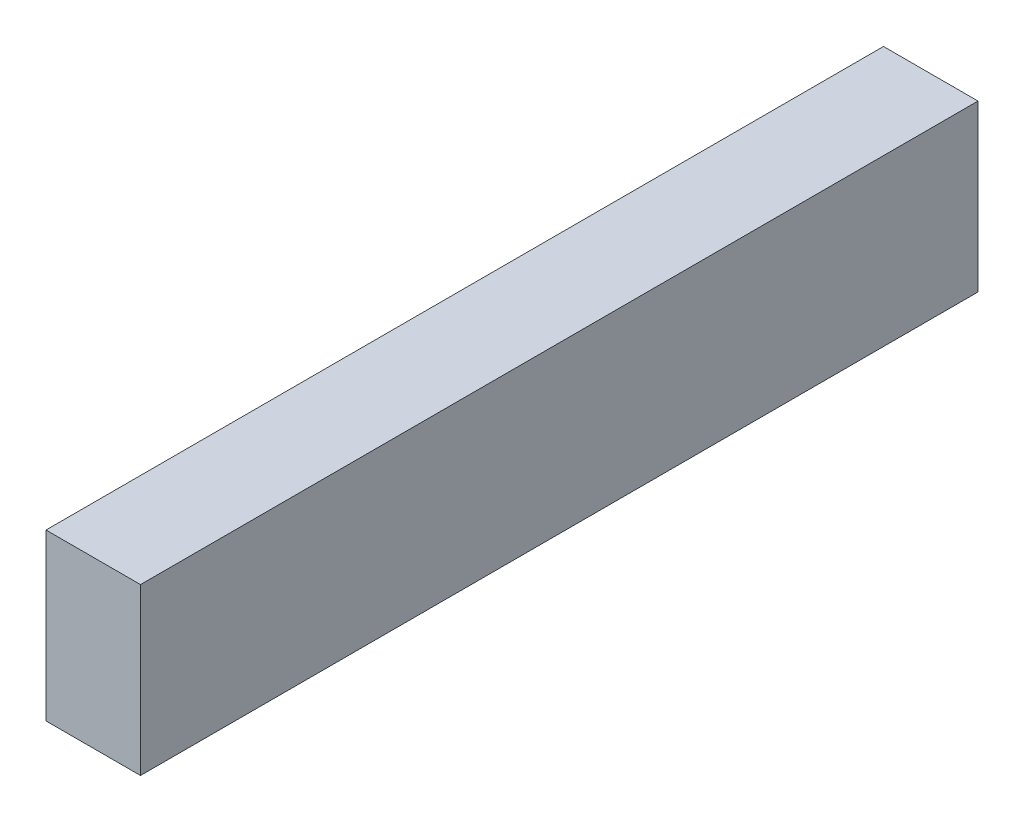
ISO-10303-21;
HEADER;
FILE_DESCRIPTION(('STEP AP214'),'2;1');
FILE_NAME('part.step','',(''),(''),'','','');
FILE_SCHEMA(('AUTOMOTIVE_DESIGN { 1 0 10303 214 1 1 1 1 }'));
ENDSEC;
DATA;
#1=APPLICATION_CONTEXT('core data for automotive mechanical design processes');
#2=APPLICATION_PROTOCOL_DEFINITION('international standard','automotive_design',2000,#1);
#3=PRODUCT_CONTEXT('',#1,'mechanical');
#4=PRODUCT('Part','Part','',(#3));
#5=PRODUCT_RELATED_PRODUCT_CATEGORY('part','',(#4));
#6=PRODUCT_DEFINITION_FORMATION('','',#4);
#7=PRODUCT_DEFINITION_CONTEXT('part definition',#1,'design');
#8=PRODUCT_DEFINITION('design','',#6,#7);
#9=PRODUCT_DEFINITION_SHAPE('','',#8);
#10=(LENGTH_UNIT() NAMED_UNIT(*) SI_UNIT(.MILLI.,.METRE.));
#11=(NAMED_UNIT(*) PLANE_ANGLE_UNIT() SI_UNIT($,.RADIAN.));
#12=(NAMED_UNIT(*) SI_UNIT($,.STERADIAN.) SOLID_ANGLE_UNIT());
#13=UNCERTAINTY_MEASURE_WITH_UNIT(LENGTH_MEASURE(1.E-05),#10,'distance_accuracy_value','');
#14=(GEOMETRIC_REPRESENTATION_CONTEXT(3) GLOBAL_UNCERTAINTY_ASSIGNED_CONTEXT((#13)) GLOBAL_UNIT_ASSIGNED_CONTEXT((#10,
#11,#12)) REPRESENTATION_CONTEXT('',''));
#15=CARTESIAN_POINT('',(0.,0.,0.));
#16=DIRECTION('',(0.,0.,1.));
#17=DIRECTION('',(1.,0.,0.));
#18=AXIS2_PLACEMENT_3D('',#15,#16,#17);
#19=CARTESIAN_POINT('',(75.2413447330454,7.,104.549040647201));
#20=DIRECTION('',(0.,0.,-1.));
#21=DIRECTION('',(-1.,0.,0.));
#22=AXIS2_PLACEMENT_3D('',#19,#20,#21);
#23=PLANE('',#22);
#24=DIRECTION('',(1.,0.,0.));
#25=VECTOR('',#24,1.);
#26=CARTESIAN_POINT('',(75.2413447330454,0.,104.549040647201));
#27=LINE('',#26,#25);
#28=CARTESIAN_POINT('',(75.2413447330454,0.,104.549040647201));
#29=VERTEX_POINT('',#28);
#30=CARTESIAN_POINT('',(79.2413447330454,0.,104.549040647201));
#31=VERTEX_POINT('',#30);
#32=EDGE_CURVE('E11',#29,#31,#27,.T.);
#33=ORIENTED_EDGE('',*,*,#32,.F.);
#34=DIRECTION('',(0.,-1.,0.));
#35=VECTOR('',#34,1.);
#36=CARTESIAN_POINT('',(75.2413447330454,7.,104.549040647201));
#37=LINE('',#36,#35);
#38=CARTESIAN_POINT('',(75.2413447330454,7.,104.549040647201));
#39=VERTEX_POINT('',#38);
#40=EDGE_CURVE('E89',#39,#29,#37,.T.);
#41=ORIENTED_EDGE('',*,*,#40,.F.);
#42=DIRECTION('',(1.,0.,0.));
#43=VECTOR('',#42,1.);
#44=CARTESIAN_POINT('',(75.2413447330454,7.,104.549040647201));
#45=LINE('',#44,#43);
#46=CARTESIAN_POINT('',(79.2413447330454,7.,104.549040647201));
#47=VERTEX_POINT('',#46);
#48=EDGE_CURVE('E46',#39,#47,#45,.T.);
#49=ORIENTED_EDGE('',*,*,#48,.T.);
#50=DIRECTION('',(0.,-1.,0.));
#51=VECTOR('',#50,1.);
#52=CARTESIAN_POINT('',(79.2413447330454,7.,104.549040647201));
#53=LINE('',#52,#51);
#54=EDGE_CURVE('E61',#47,#31,#53,.T.);
#55=ORIENTED_EDGE('',*,*,#54,.T.);
#56=EDGE_LOOP('',(#33,#41,#49,#55));
#57=FACE_BOUND('',#56,.T.);
#58=ADVANCED_FACE('F42',(#57),#23,.T.);
#59=CARTESIAN_POINT('',(75.2413447330454,7.,140.));
#60=DIRECTION('',(-1.,0.,0.));
#61=DIRECTION('',(0.,0.,1.));
#62=AXIS2_PLACEMENT_3D('',#59,#60,#61);
#63=PLANE('',#62);
#64=DIRECTION('',(0.,0.,-1.));
#65=VECTOR('',#64,1.);
#66=CARTESIAN_POINT('',(75.2413447330454,0.,140.));
#67=LINE('',#66,#65);
#68=CARTESIAN_POINT('',(75.2413447330454,0.,140.));
#69=VERTEX_POINT('',#68);
#70=EDGE_CURVE('E102',#69,#29,#67,.T.);
#71=ORIENTED_EDGE('',*,*,#70,.F.);
#72=DIRECTION('',(0.,-1.,0.));
#73=VECTOR('',#72,1.);
#74=CARTESIAN_POINT('',(75.2413447330454,7.,140.));
#75=LINE('',#74,#73);
#76=CARTESIAN_POINT('',(75.2413447330454,7.,140.));
#77=VERTEX_POINT('',#76);
#78=EDGE_CURVE('E91',#77,#69,#75,.T.);
#79=ORIENTED_EDGE('',*,*,#78,.F.);
#80=DIRECTION('',(0.,0.,-1.));
#81=VECTOR('',#80,1.);
#82=CARTESIAN_POINT('',(75.2413447330454,7.,140.));
#83=LINE('',#82,#81);
#84=EDGE_CURVE('E110',#77,#39,#83,.T.);
#85=ORIENTED_EDGE('',*,*,#84,.T.);
#86=ORIENTED_EDGE('',*,*,#40,.T.);
#87=EDGE_LOOP('',(#71,#79,#85,#86));
#88=FACE_BOUND('',#87,.T.);
#89=ADVANCED_FACE('F104',(#88),#63,.T.);
#90=CARTESIAN_POINT('',(79.2413447330454,7.,140.));
#91=DIRECTION('',(0.,0.,1.));
#92=DIRECTION('',(1.,0.,0.));
#93=AXIS2_PLACEMENT_3D('',#90,#91,#92);
#94=PLANE('',#93);
#95=DIRECTION('',(-1.,0.,0.));
#96=VECTOR('',#95,1.);
#97=CARTESIAN_POINT('',(79.2413447330454,0.,140.));
#98=LINE('',#97,#96);
#99=CARTESIAN_POINT('',(79.2413447330454,0.,140.));
#100=VERTEX_POINT('',#99);
#101=EDGE_CURVE('E94',#100,#69,#98,.T.);
#102=ORIENTED_EDGE('',*,*,#101,.F.);
#103=DIRECTION('',(0.,-1.,0.));
#104=VECTOR('',#103,1.);
#105=CARTESIAN_POINT('',(79.2413447330454,7.,140.));
#106=LINE('',#105,#104);
#107=CARTESIAN_POINT('',(79.2413447330454,7.,140.));
#108=VERTEX_POINT('',#107);
#109=EDGE_CURVE('E78',#108,#100,#106,.T.);
#110=ORIENTED_EDGE('',*,*,#109,.F.);
#111=DIRECTION('',(-1.,0.,0.));
#112=VECTOR('',#111,1.);
#113=CARTESIAN_POINT('',(79.2413447330454,7.,140.));
#114=LINE('',#113,#112);
#115=EDGE_CURVE('E96',#108,#77,#114,.T.);
#116=ORIENTED_EDGE('',*,*,#115,.T.);
#117=ORIENTED_EDGE('',*,*,#78,.T.);
#118=EDGE_LOOP('',(#102,#110,#116,#117));
#119=FACE_BOUND('',#118,.T.);
#120=ADVANCED_FACE('F93',(#119),#94,.T.);
#121=CARTESIAN_POINT('',(79.2413447330454,7.,104.549040647201));
#122=DIRECTION('',(1.,0.,0.));
#123=DIRECTION('',(0.,0.,-1.));
#124=AXIS2_PLACEMENT_3D('',#121,#122,#123);
#125=PLANE('',#124);
#126=DIRECTION('',(0.,0.,1.));
#127=VECTOR('',#126,1.);
#128=CARTESIAN_POINT('',(79.2413447330454,0.,104.549040647201));
#129=LINE('',#128,#127);
#130=EDGE_CURVE('E52',#31,#100,#129,.T.);
#131=ORIENTED_EDGE('',*,*,#130,.F.);
#132=ORIENTED_EDGE('',*,*,#54,.F.);
#133=DIRECTION('',(0.,0.,1.));
#134=VECTOR('',#133,1.);
#135=CARTESIAN_POINT('',(79.2413447330454,7.,104.549040647201));
#136=LINE('',#135,#134);
#137=EDGE_CURVE('E106',#47,#108,#136,.T.);
#138=ORIENTED_EDGE('',*,*,#137,.T.);
#139=ORIENTED_EDGE('',*,*,#109,.T.);
#140=EDGE_LOOP('',(#131,#132,#138,#139));
#141=FACE_BOUND('',#140,.T.);
#142=ADVANCED_FACE('F112',(#141),#125,.T.);
#143=CARTESIAN_POINT('',(0.,7.,0.));
#144=DIRECTION('',(0.,-1.,0.));
#145=DIRECTION('',(0.,0.,-1.));
#146=AXIS2_PLACEMENT_3D('',#143,#144,#145);
#147=PLANE('',#146);
#148=ORIENTED_EDGE('',*,*,#48,.F.);
#149=ORIENTED_EDGE('',*,*,#84,.F.);
#150=ORIENTED_EDGE('',*,*,#115,.F.);
#151=ORIENTED_EDGE('',*,*,#137,.F.);
#152=EDGE_LOOP('',(#148,#149,#150,#151));
#153=FACE_BOUND('',#152,.T.);
#154=ADVANCED_FACE('F44',(#153),#147,.F.);
#155=CARTESIAN_POINT('',(0.,0.,0.));
#156=DIRECTION('',(0.,-1.,0.));
#157=DIRECTION('',(0.,0.,-1.));
#158=AXIS2_PLACEMENT_3D('',#155,#156,#157);
#159=PLANE('',#158);
#160=ORIENTED_EDGE('',*,*,#32,.T.);
#161=ORIENTED_EDGE('',*,*,#130,.T.);
#162=ORIENTED_EDGE('',*,*,#101,.T.);
#163=ORIENTED_EDGE('',*,*,#70,.T.);
#164=EDGE_LOOP('',(#160,#161,#162,#163));
#165=FACE_BOUND('',#164,.T.);
#166=ADVANCED_FACE('F101',(#165),#159,.T.);
#167=CLOSED_SHELL('',(#58,#89,#120,#142,#154,#166));
#168=MANIFOLD_SOLID_BREP('B2',#167);
#169=ADVANCED_BREP_SHAPE_REPRESENTATION('',(#18,#168),#14);
#170=SHAPE_DEFINITION_REPRESENTATION(#9,#169);
ENDSEC;
END-ISO-10303-21;
